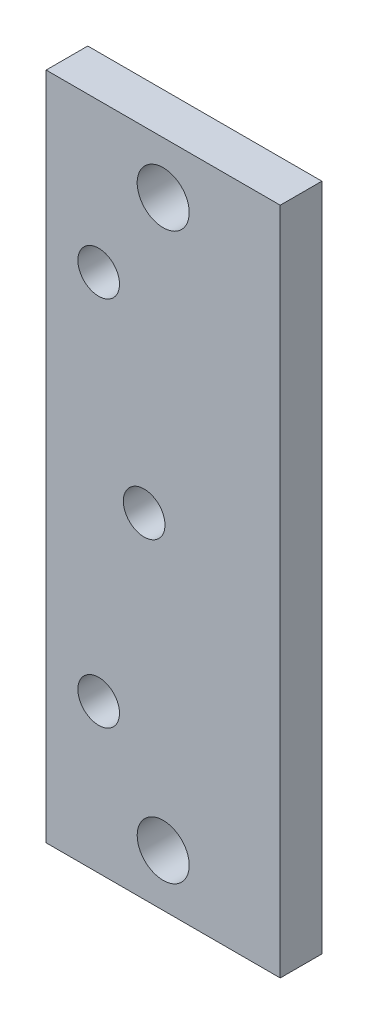
ISO-10303-21;
HEADER;
FILE_DESCRIPTION(('STEP AP214'),'2;1');
FILE_NAME('part.step','',(''),(''),'','','');
FILE_SCHEMA(('AUTOMOTIVE_DESIGN { 1 0 10303 214 1 1 1 1 }'));
ENDSEC;
DATA;
#1=APPLICATION_CONTEXT('core data for automotive mechanical design processes');
#2=APPLICATION_PROTOCOL_DEFINITION('international standard','automotive_design',2000,#1);
#3=PRODUCT_CONTEXT('',#1,'mechanical');
#4=PRODUCT('Part','Part','',(#3));
#5=PRODUCT_RELATED_PRODUCT_CATEGORY('part','',(#4));
#6=PRODUCT_DEFINITION_FORMATION('','',#4);
#7=PRODUCT_DEFINITION_CONTEXT('part definition',#1,'design');
#8=PRODUCT_DEFINITION('design','',#6,#7);
#9=PRODUCT_DEFINITION_SHAPE('','',#8);
#10=(LENGTH_UNIT() NAMED_UNIT(*) SI_UNIT(.MILLI.,.METRE.));
#11=(NAMED_UNIT(*) PLANE_ANGLE_UNIT() SI_UNIT($,.RADIAN.));
#12=(NAMED_UNIT(*) SI_UNIT($,.STERADIAN.) SOLID_ANGLE_UNIT());
#13=UNCERTAINTY_MEASURE_WITH_UNIT(LENGTH_MEASURE(1.E-05),#10,'distance_accuracy_value','');
#14=(GEOMETRIC_REPRESENTATION_CONTEXT(3) GLOBAL_UNCERTAINTY_ASSIGNED_CONTEXT((#13)) GLOBAL_UNIT_ASSIGNED_CONTEXT((#10,
#11,#12)) REPRESENTATION_CONTEXT('',''));
#15=CARTESIAN_POINT('',(0.,0.,0.));
#16=DIRECTION('',(0.,0.,1.));
#17=DIRECTION('',(1.,0.,0.));
#18=AXIS2_PLACEMENT_3D('',#15,#16,#17);
#19=CARTESIAN_POINT('',(0.,0.,0.));
#20=DIRECTION('',(0.,0.,1.));
#21=DIRECTION('',(1.,0.,0.));
#22=AXIS2_PLACEMENT_3D('',#19,#20,#21);
#23=PLANE('',#22);
#24=CARTESIAN_POINT('',(10.1018,-28.6106,0.));
#25=DIRECTION('',(0.,0.,1.));
#26=DIRECTION('',(1.,0.,0.));
#27=AXIS2_PLACEMENT_3D('',#24,#25,#26);
#28=CIRCLE('',#27,4.);
#29=CARTESIAN_POINT('',(14.1018,-28.6106,0.));
#30=VERTEX_POINT('',#29);
#31=EDGE_CURVE('E258',#30,#30,#28,.F.);
#32=ORIENTED_EDGE('',*,*,#31,.F.);
#33=EDGE_LOOP('',(#32));
#34=FACE_BOUND('',#33,.T.);
#35=CARTESIAN_POINT('',(10.1018,-100.0354,0.));
#36=DIRECTION('',(0.,0.,1.));
#37=DIRECTION('',(1.,0.,0.));
#38=AXIS2_PLACEMENT_3D('',#35,#36,#37);
#39=CIRCLE('',#38,4.);
#40=CARTESIAN_POINT('',(14.1018,-100.0354,0.));
#41=VERTEX_POINT('',#40);
#42=EDGE_CURVE('E279',#41,#41,#39,.F.);
#43=ORIENTED_EDGE('',*,*,#42,.F.);
#44=EDGE_LOOP('',(#43));
#45=FACE_BOUND('',#44,.T.);
#46=CARTESIAN_POINT('',(18.84,-64.323,0.));
#47=DIRECTION('',(0.,0.,1.));
#48=DIRECTION('',(1.,0.,0.));
#49=AXIS2_PLACEMENT_3D('',#46,#47,#48);
#50=CIRCLE('',#49,4.);
#51=CARTESIAN_POINT('',(22.84,-64.323,0.));
#52=VERTEX_POINT('',#51);
#53=EDGE_CURVE('E272',#52,#52,#50,.F.);
#54=ORIENTED_EDGE('',*,*,#53,.F.);
#55=EDGE_LOOP('',(#54));
#56=FACE_BOUND('',#55,.T.);
#57=DIRECTION('',(0.,-1.,0.));
#58=VECTOR('',#57,1.);
#59=CARTESIAN_POINT('',(27.5,-74.323,0.));
#60=LINE('',#59,#58);
#61=CARTESIAN_POINT('',(27.5,-74.323,0.));
#62=VERTEX_POINT('',#61);
#63=CARTESIAN_POINT('',(27.5,-108.646,0.));
#64=VERTEX_POINT('',#63);
#65=EDGE_CURVE('E145',#62,#64,#60,.T.);
#66=ORIENTED_EDGE('',*,*,#65,.F.);
#67=DIRECTION('',(1.,0.,0.));
#68=VECTOR('',#67,1.);
#69=CARTESIAN_POINT('',(27.5,-74.323,0.));
#70=LINE('',#69,#68);
#71=CARTESIAN_POINT('',(17.5,-74.323,0.));
#72=VERTEX_POINT('',#71);
#73=EDGE_CURVE('E158',#72,#62,#70,.T.);
#74=ORIENTED_EDGE('',*,*,#73,.F.);
#75=DIRECTION('',(0.,1.,0.));
#76=VECTOR('',#75,1.);
#77=CARTESIAN_POINT('',(17.5,-108.646,0.));
#78=LINE('',#77,#76);
#79=CARTESIAN_POINT('',(17.5,-108.646,0.));
#80=VERTEX_POINT('',#79);
#81=EDGE_CURVE('E167',#80,#72,#78,.T.);
#82=ORIENTED_EDGE('',*,*,#81,.F.);
#83=DIRECTION('',(-1.,0.,0.));
#84=VECTOR('',#83,1.);
#85=CARTESIAN_POINT('',(27.5,-108.646,0.));
#86=LINE('',#85,#84);
#87=EDGE_CURVE('E148',#64,#80,#86,.T.);
#88=ORIENTED_EDGE('',*,*,#87,.F.);
#89=EDGE_LOOP('',(#66,#74,#82,#88));
#90=FACE_BOUND('',#89,.T.);
#91=DIRECTION('',(0.,1.,0.));
#92=VECTOR('',#91,1.);
#93=CARTESIAN_POINT('',(45.,-128.646,0.));
#94=LINE('',#93,#92);
#95=CARTESIAN_POINT('',(45.,-128.646,0.));
#96=VERTEX_POINT('',#95);
#97=CARTESIAN_POINT('',(45.,0.,0.));
#98=VERTEX_POINT('',#97);
#99=EDGE_CURVE('E193',#96,#98,#94,.T.);
#100=ORIENTED_EDGE('',*,*,#99,.F.);
#101=DIRECTION('',(1.,0.,0.));
#102=VECTOR('',#101,1.);
#103=CARTESIAN_POINT('',(0.,-128.646,0.));
#104=LINE('',#103,#102);
#105=CARTESIAN_POINT('',(0.,-128.646,0.));
#106=VERTEX_POINT('',#105);
#107=EDGE_CURVE('E200',#106,#96,#104,.T.);
#108=ORIENTED_EDGE('',*,*,#107,.F.);
#109=DIRECTION('',(0.,-1.,0.));
#110=VECTOR('',#109,1.);
#111=CARTESIAN_POINT('',(0.,-128.646,0.));
#112=LINE('',#111,#110);
#113=CARTESIAN_POINT('',(0.,0.,0.));
#114=VERTEX_POINT('',#113);
#115=EDGE_CURVE('E212',#114,#106,#112,.T.);
#116=ORIENTED_EDGE('',*,*,#115,.F.);
#117=DIRECTION('',(-1.,0.,0.));
#118=VECTOR('',#117,1.);
#119=CARTESIAN_POINT('',(0.,0.,0.));
#120=LINE('',#119,#118);
#121=EDGE_CURVE('E209',#98,#114,#120,.T.);
#122=ORIENTED_EDGE('',*,*,#121,.F.);
#123=EDGE_LOOP('',(#100,#108,#116,#122));
#124=FACE_BOUND('',#123,.T.);
#125=CARTESIAN_POINT('',(22.5,-9.99999999999999,0.));
#126=DIRECTION('',(0.,0.,1.));
#127=DIRECTION('',(1.,0.,0.));
#128=AXIS2_PLACEMENT_3D('',#125,#126,#127);
#129=CIRCLE('',#128,5.);
#130=CARTESIAN_POINT('',(27.5,-9.99999999999999,0.));
#131=VERTEX_POINT('',#130);
#132=EDGE_CURVE('E187',#131,#131,#129,.T.);
#133=ORIENTED_EDGE('',*,*,#132,.T.);
#134=EDGE_LOOP('',(#133));
#135=FACE_BOUND('',#134,.T.);
#136=CARTESIAN_POINT('',(22.5,-118.646,0.));
#137=DIRECTION('',(0.,0.,1.));
#138=DIRECTION('',(-1.,0.,0.));
#139=AXIS2_PLACEMENT_3D('',#136,#137,#138);
#140=CIRCLE('',#139,5.);
#141=CARTESIAN_POINT('',(17.5,-118.646,0.));
#142=VERTEX_POINT('',#141);
#143=EDGE_CURVE('E183',#142,#142,#140,.T.);
#144=ORIENTED_EDGE('',*,*,#143,.T.);
#145=EDGE_LOOP('',(#144));
#146=FACE_BOUND('',#145,.T.);
#147=DIRECTION('',(0.,-1.,0.));
#148=VECTOR('',#147,1.);
#149=CARTESIAN_POINT('',(27.5,-20.,0.));
#150=LINE('',#149,#148);
#151=CARTESIAN_POINT('',(27.5,-20.,0.));
#152=VERTEX_POINT('',#151);
#153=CARTESIAN_POINT('',(27.5,-54.323,0.));
#154=VERTEX_POINT('',#153);
#155=EDGE_CURVE('E144',#152,#154,#150,.T.);
#156=ORIENTED_EDGE('',*,*,#155,.F.);
#157=DIRECTION('',(1.,0.,0.));
#158=VECTOR('',#157,1.);
#159=CARTESIAN_POINT('',(17.5,-20.,0.));
#160=LINE('',#159,#158);
#161=CARTESIAN_POINT('',(17.5,-20.,0.));
#162=VERTEX_POINT('',#161);
#163=EDGE_CURVE('E141',#162,#152,#160,.T.);
#164=ORIENTED_EDGE('',*,*,#163,.F.);
#165=DIRECTION('',(0.,1.,0.));
#166=VECTOR('',#165,1.);
#167=CARTESIAN_POINT('',(17.5,-54.323,0.));
#168=LINE('',#167,#166);
#169=CARTESIAN_POINT('',(17.5,-54.323,0.));
#170=VERTEX_POINT('',#169);
#171=EDGE_CURVE('E55',#170,#162,#168,.T.);
#172=ORIENTED_EDGE('',*,*,#171,.F.);
#173=DIRECTION('',(-1.,0.,0.));
#174=VECTOR('',#173,1.);
#175=CARTESIAN_POINT('',(27.5,-54.323,0.));
#176=LINE('',#175,#174);
#177=EDGE_CURVE('E50',#154,#170,#176,.T.);
#178=ORIENTED_EDGE('',*,*,#177,.F.);
#179=EDGE_LOOP('',(#156,#164,#172,#178));
#180=FACE_BOUND('',#179,.T.);
#181=ADVANCED_FACE('F35',(#34,#45,#56,#90,#124,#135,#146,#180),#23,.F.);
#182=CARTESIAN_POINT('',(0.,0.,8.));
#183=DIRECTION('',(0.,0.,1.));
#184=DIRECTION('',(1.,0.,0.));
#185=AXIS2_PLACEMENT_3D('',#182,#183,#184);
#186=PLANE('',#185);
#187=CARTESIAN_POINT('',(10.1018,-28.6106,8.));
#188=DIRECTION('',(0.,0.,1.));
#189=DIRECTION('',(1.,0.,0.));
#190=AXIS2_PLACEMENT_3D('',#187,#188,#189);
#191=CIRCLE('',#190,4.);
#192=CARTESIAN_POINT('',(14.1018,-28.6106,8.));
#193=VERTEX_POINT('',#192);
#194=EDGE_CURVE('E282',#193,#193,#191,.T.);
#195=ORIENTED_EDGE('',*,*,#194,.F.);
#196=EDGE_LOOP('',(#195));
#197=FACE_BOUND('',#196,.T.);
#198=CARTESIAN_POINT('',(10.1018,-100.0354,8.));
#199=DIRECTION('',(0.,0.,1.));
#200=DIRECTION('',(-1.,0.,0.));
#201=AXIS2_PLACEMENT_3D('',#198,#199,#200);
#202=CIRCLE('',#201,4.);
#203=CARTESIAN_POINT('',(14.1018,-100.0354,8.));
#204=VERTEX_POINT('',#203);
#205=EDGE_CURVE('E275',#204,#204,#202,.T.);
#206=ORIENTED_EDGE('',*,*,#205,.F.);
#207=EDGE_LOOP('',(#206));
#208=FACE_BOUND('',#207,.T.);
#209=CARTESIAN_POINT('',(18.84,-64.323,8.));
#210=DIRECTION('',(0.,0.,1.));
#211=DIRECTION('',(1.,0.,0.));
#212=AXIS2_PLACEMENT_3D('',#209,#210,#211);
#213=CIRCLE('',#212,4.);
#214=CARTESIAN_POINT('',(22.84,-64.323,8.));
#215=VERTEX_POINT('',#214);
#216=EDGE_CURVE('E276',#215,#215,#213,.T.);
#217=ORIENTED_EDGE('',*,*,#216,.F.);
#218=EDGE_LOOP('',(#217));
#219=FACE_BOUND('',#218,.T.);
#220=CARTESIAN_POINT('',(22.5,-9.99999999999999,8.));
#221=DIRECTION('',(0.,0.,1.));
#222=DIRECTION('',(1.,0.,0.));
#223=AXIS2_PLACEMENT_3D('',#220,#221,#222);
#224=CIRCLE('',#223,5.);
#225=CARTESIAN_POINT('',(27.5,-9.99999999999999,8.));
#226=VERTEX_POINT('',#225);
#227=EDGE_CURVE('E190',#226,#226,#224,.T.);
#228=ORIENTED_EDGE('',*,*,#227,.F.);
#229=EDGE_LOOP('',(#228));
#230=FACE_BOUND('',#229,.T.);
#231=DIRECTION('',(1.,0.,0.));
#232=VECTOR('',#231,1.);
#233=CARTESIAN_POINT('',(5.55000000000001,-128.646,8.));
#234=LINE('',#233,#232);
#235=CARTESIAN_POINT('',(0.,-128.646,8.));
#236=VERTEX_POINT('',#235);
#237=CARTESIAN_POINT('',(45.,-128.646,8.));
#238=VERTEX_POINT('',#237);
#239=EDGE_CURVE('E196',#236,#238,#234,.T.);
#240=ORIENTED_EDGE('',*,*,#239,.T.);
#241=DIRECTION('',(0.,1.,0.));
#242=VECTOR('',#241,1.);
#243=CARTESIAN_POINT('',(45.,-128.646,8.));
#244=LINE('',#243,#242);
#245=CARTESIAN_POINT('',(45.,0.,8.));
#246=VERTEX_POINT('',#245);
#247=EDGE_CURVE('E199',#238,#246,#244,.T.);
#248=ORIENTED_EDGE('',*,*,#247,.T.);
#249=DIRECTION('',(-1.,0.,0.));
#250=VECTOR('',#249,1.);
#251=CARTESIAN_POINT('',(5.,0.,8.));
#252=LINE('',#251,#250);
#253=CARTESIAN_POINT('',(0.,0.,8.));
#254=VERTEX_POINT('',#253);
#255=EDGE_CURVE('E202',#246,#254,#252,.T.);
#256=ORIENTED_EDGE('',*,*,#255,.T.);
#257=DIRECTION('',(0.,-1.,0.));
#258=VECTOR('',#257,1.);
#259=CARTESIAN_POINT('',(0.,-64.323,8.));
#260=LINE('',#259,#258);
#261=EDGE_CURVE('E204',#254,#236,#260,.T.);
#262=ORIENTED_EDGE('',*,*,#261,.T.);
#263=EDGE_LOOP('',(#240,#248,#256,#262));
#264=FACE_BOUND('',#263,.T.);
#265=CARTESIAN_POINT('',(22.5,-118.646,8.));
#266=DIRECTION('',(0.,0.,1.));
#267=DIRECTION('',(-1.,0.,0.));
#268=AXIS2_PLACEMENT_3D('',#265,#266,#267);
#269=CIRCLE('',#268,5.);
#270=CARTESIAN_POINT('',(17.5,-118.646,8.));
#271=VERTEX_POINT('',#270);
#272=EDGE_CURVE('E184',#271,#271,#269,.T.);
#273=ORIENTED_EDGE('',*,*,#272,.F.);
#274=EDGE_LOOP('',(#273));
#275=FACE_BOUND('',#274,.T.);
#276=ADVANCED_FACE('F239',(#197,#208,#219,#230,#264,#275),#186,.T.);
#277=CARTESIAN_POINT('',(45.,-128.646,8.));
#278=DIRECTION('',(-1.,0.,0.));
#279=DIRECTION('',(0.,-1.,0.));
#280=AXIS2_PLACEMENT_3D('',#277,#278,#279);
#281=PLANE('',#280);
#282=ORIENTED_EDGE('',*,*,#99,.T.);
#283=DIRECTION('',(0.,0.,-1.));
#284=VECTOR('',#283,1.);
#285=CARTESIAN_POINT('',(45.,0.,8.));
#286=LINE('',#285,#284);
#287=EDGE_CURVE('E43',#246,#98,#286,.T.);
#288=ORIENTED_EDGE('',*,*,#287,.F.);
#289=ORIENTED_EDGE('',*,*,#247,.F.);
#290=DIRECTION('',(0.,0.,-1.));
#291=VECTOR('',#290,1.);
#292=CARTESIAN_POINT('',(45.,-128.646,8.));
#293=LINE('',#292,#291);
#294=EDGE_CURVE('E11',#238,#96,#293,.T.);
#295=ORIENTED_EDGE('',*,*,#294,.T.);
#296=EDGE_LOOP('',(#282,#288,#289,#295));
#297=FACE_BOUND('',#296,.T.);
#298=ADVANCED_FACE('F37',(#297),#281,.F.);
#299=CARTESIAN_POINT('',(0.,0.,8.));
#300=DIRECTION('',(0.,-1.,0.));
#301=DIRECTION('',(1.,0.,0.));
#302=AXIS2_PLACEMENT_3D('',#299,#300,#301);
#303=PLANE('',#302);
#304=ORIENTED_EDGE('',*,*,#121,.T.);
#305=DIRECTION('',(0.,0.,-1.));
#306=VECTOR('',#305,1.);
#307=CARTESIAN_POINT('',(0.,0.,8.));
#308=LINE('',#307,#306);
#309=EDGE_CURVE('E217',#254,#114,#308,.T.);
#310=ORIENTED_EDGE('',*,*,#309,.F.);
#311=ORIENTED_EDGE('',*,*,#255,.F.);
#312=ORIENTED_EDGE('',*,*,#287,.T.);
#313=EDGE_LOOP('',(#304,#310,#311,#312));
#314=FACE_BOUND('',#313,.T.);
#315=ADVANCED_FACE('F223',(#314),#303,.F.);
#316=CARTESIAN_POINT('',(0.,-128.646,8.));
#317=DIRECTION('',(1.,0.,0.));
#318=DIRECTION('',(0.,1.,0.));
#319=AXIS2_PLACEMENT_3D('',#316,#317,#318);
#320=PLANE('',#319);
#321=ORIENTED_EDGE('',*,*,#115,.T.);
#322=DIRECTION('',(0.,0.,-1.));
#323=VECTOR('',#322,1.);
#324=CARTESIAN_POINT('',(0.,-128.646,8.));
#325=LINE('',#324,#323);
#326=EDGE_CURVE('E206',#236,#106,#325,.T.);
#327=ORIENTED_EDGE('',*,*,#326,.F.);
#328=ORIENTED_EDGE('',*,*,#261,.F.);
#329=ORIENTED_EDGE('',*,*,#309,.T.);
#330=EDGE_LOOP('',(#321,#327,#328,#329));
#331=FACE_BOUND('',#330,.T.);
#332=ADVANCED_FACE('F233',(#331),#320,.F.);
#333=CARTESIAN_POINT('',(0.,-128.646,8.));
#334=DIRECTION('',(0.,1.,0.));
#335=DIRECTION('',(0.,0.,1.));
#336=AXIS2_PLACEMENT_3D('',#333,#334,#335);
#337=PLANE('',#336);
#338=ORIENTED_EDGE('',*,*,#107,.T.);
#339=ORIENTED_EDGE('',*,*,#294,.F.);
#340=ORIENTED_EDGE('',*,*,#239,.F.);
#341=ORIENTED_EDGE('',*,*,#326,.T.);
#342=EDGE_LOOP('',(#338,#339,#340,#341));
#343=FACE_BOUND('',#342,.T.);
#344=ADVANCED_FACE('F237',(#343),#337,.F.);
#345=CARTESIAN_POINT('',(22.5,-9.99999999999999,8.));
#346=DIRECTION('',(0.,0.,-1.));
#347=DIRECTION('',(-1.,0.,0.));
#348=AXIS2_PLACEMENT_3D('',#345,#346,#347);
#349=CYLINDRICAL_SURFACE('',#348,5.);
#350=ORIENTED_EDGE('',*,*,#227,.T.);
#351=EDGE_LOOP('',(#350));
#352=FACE_BOUND('',#351,.T.);
#353=ORIENTED_EDGE('',*,*,#132,.F.);
#354=EDGE_LOOP('',(#353));
#355=FACE_BOUND('',#354,.T.);
#356=ADVANCED_FACE('F250',(#352,#355),#349,.F.);
#357=CARTESIAN_POINT('',(22.5,-118.646,8.));
#358=DIRECTION('',(0.,0.,-1.));
#359=DIRECTION('',(-1.,0.,0.));
#360=AXIS2_PLACEMENT_3D('',#357,#358,#359);
#361=CYLINDRICAL_SURFACE('',#360,5.);
#362=ORIENTED_EDGE('',*,*,#272,.T.);
#363=EDGE_LOOP('',(#362));
#364=FACE_BOUND('',#363,.T.);
#365=ORIENTED_EDGE('',*,*,#143,.F.);
#366=EDGE_LOOP('',(#365));
#367=FACE_BOUND('',#366,.T.);
#368=ADVANCED_FACE('F246',(#364,#367),#361,.F.);
#369=CARTESIAN_POINT('',(27.5,-74.323,-6.));
#370=DIRECTION('',(-1.,0.,0.));
#371=DIRECTION('',(0.,-1.,0.));
#372=AXIS2_PLACEMENT_3D('',#369,#370,#371);
#373=PLANE('',#372);
#374=ORIENTED_EDGE('',*,*,#65,.T.);
#375=DIRECTION('',(0.,0.,1.));
#376=VECTOR('',#375,1.);
#377=CARTESIAN_POINT('',(27.5,-108.646,-6.));
#378=LINE('',#377,#376);
#379=CARTESIAN_POINT('',(27.5,-108.646,-6.));
#380=VERTEX_POINT('',#379);
#381=EDGE_CURVE('E180',#380,#64,#378,.T.);
#382=ORIENTED_EDGE('',*,*,#381,.F.);
#383=DIRECTION('',(0.,-1.,0.));
#384=VECTOR('',#383,1.);
#385=CARTESIAN_POINT('',(27.5,-74.323,-6.));
#386=LINE('',#385,#384);
#387=CARTESIAN_POINT('',(27.5,-74.323,-6.));
#388=VERTEX_POINT('',#387);
#389=EDGE_CURVE('E154',#388,#380,#386,.T.);
#390=ORIENTED_EDGE('',*,*,#389,.F.);
#391=DIRECTION('',(0.,0.,1.));
#392=VECTOR('',#391,1.);
#393=CARTESIAN_POINT('',(27.5,-74.323,-6.));
#394=LINE('',#393,#392);
#395=EDGE_CURVE('E163',#388,#62,#394,.T.);
#396=ORIENTED_EDGE('',*,*,#395,.T.);
#397=EDGE_LOOP('',(#374,#382,#390,#396));
#398=FACE_BOUND('',#397,.T.);
#399=ADVANCED_FACE('F249',(#398),#373,.F.);
#400=CARTESIAN_POINT('',(27.5,-108.646,-6.));
#401=DIRECTION('',(0.,1.,0.));
#402=DIRECTION('',(0.,0.,1.));
#403=AXIS2_PLACEMENT_3D('',#400,#401,#402);
#404=PLANE('',#403);
#405=ORIENTED_EDGE('',*,*,#87,.T.);
#406=DIRECTION('',(0.,0.,1.));
#407=VECTOR('',#406,1.);
#408=CARTESIAN_POINT('',(17.5,-108.646,-6.));
#409=LINE('',#408,#407);
#410=CARTESIAN_POINT('',(17.5,-108.646,-6.));
#411=VERTEX_POINT('',#410);
#412=EDGE_CURVE('E177',#411,#80,#409,.T.);
#413=ORIENTED_EDGE('',*,*,#412,.F.);
#414=DIRECTION('',(-1.,0.,0.));
#415=VECTOR('',#414,1.);
#416=CARTESIAN_POINT('',(27.5,-108.646,-6.));
#417=LINE('',#416,#415);
#418=EDGE_CURVE('E157',#380,#411,#417,.T.);
#419=ORIENTED_EDGE('',*,*,#418,.F.);
#420=ORIENTED_EDGE('',*,*,#381,.T.);
#421=EDGE_LOOP('',(#405,#413,#419,#420));
#422=FACE_BOUND('',#421,.T.);
#423=ADVANCED_FACE('F402',(#422),#404,.F.);
#424=CARTESIAN_POINT('',(17.5,-108.646,-6.));
#425=DIRECTION('',(1.,0.,0.));
#426=DIRECTION('',(0.,1.,0.));
#427=AXIS2_PLACEMENT_3D('',#424,#425,#426);
#428=PLANE('',#427);
#429=ORIENTED_EDGE('',*,*,#81,.T.);
#430=DIRECTION('',(0.,0.,1.));
#431=VECTOR('',#430,1.);
#432=CARTESIAN_POINT('',(17.5,-74.323,-6.));
#433=LINE('',#432,#431);
#434=CARTESIAN_POINT('',(17.5,-74.323,-6.));
#435=VERTEX_POINT('',#434);
#436=EDGE_CURVE('E174',#435,#72,#433,.T.);
#437=ORIENTED_EDGE('',*,*,#436,.F.);
#438=DIRECTION('',(0.,1.,0.));
#439=VECTOR('',#438,1.);
#440=CARTESIAN_POINT('',(17.5,-108.646,-6.));
#441=LINE('',#440,#439);
#442=EDGE_CURVE('E160',#411,#435,#441,.T.);
#443=ORIENTED_EDGE('',*,*,#442,.F.);
#444=ORIENTED_EDGE('',*,*,#412,.T.);
#445=EDGE_LOOP('',(#429,#437,#443,#444));
#446=FACE_BOUND('',#445,.T.);
#447=ADVANCED_FACE('F392',(#446),#428,.F.);
#448=CARTESIAN_POINT('',(27.5,-74.323,-6.));
#449=DIRECTION('',(0.,-1.,0.));
#450=DIRECTION('',(0.,0.,-1.));
#451=AXIS2_PLACEMENT_3D('',#448,#449,#450);
#452=PLANE('',#451);
#453=ORIENTED_EDGE('',*,*,#73,.T.);
#454=ORIENTED_EDGE('',*,*,#395,.F.);
#455=DIRECTION('',(1.,0.,0.));
#456=VECTOR('',#455,1.);
#457=CARTESIAN_POINT('',(27.5,-74.323,-6.));
#458=LINE('',#457,#456);
#459=EDGE_CURVE('E162',#435,#388,#458,.T.);
#460=ORIENTED_EDGE('',*,*,#459,.F.);
#461=ORIENTED_EDGE('',*,*,#436,.T.);
#462=EDGE_LOOP('',(#453,#454,#460,#461));
#463=FACE_BOUND('',#462,.T.);
#464=ADVANCED_FACE('F382',(#463),#452,.F.);
#465=CARTESIAN_POINT('',(0.,0.,-6.));
#466=DIRECTION('',(0.,0.,-1.));
#467=DIRECTION('',(-1.,0.,0.));
#468=AXIS2_PLACEMENT_3D('',#465,#466,#467);
#469=PLANE('',#468);
#470=ORIENTED_EDGE('',*,*,#389,.T.);
#471=ORIENTED_EDGE('',*,*,#418,.T.);
#472=ORIENTED_EDGE('',*,*,#442,.T.);
#473=ORIENTED_EDGE('',*,*,#459,.T.);
#474=EDGE_LOOP('',(#470,#471,#472,#473));
#475=FACE_BOUND('',#474,.T.);
#476=ADVANCED_FACE('F373',(#475),#469,.T.);
#477=CARTESIAN_POINT('',(27.5,-20.,-6.));
#478=DIRECTION('',(-1.,0.,0.));
#479=DIRECTION('',(0.,-1.,0.));
#480=AXIS2_PLACEMENT_3D('',#477,#478,#479);
#481=PLANE('',#480);
#482=ORIENTED_EDGE('',*,*,#155,.T.);
#483=DIRECTION('',(0.,0.,1.));
#484=VECTOR('',#483,1.);
#485=CARTESIAN_POINT('',(27.5,-54.323,-6.));
#486=LINE('',#485,#484);
#487=CARTESIAN_POINT('',(27.5,-54.323,-6.));
#488=VERTEX_POINT('',#487);
#489=EDGE_CURVE('E125',#488,#154,#486,.T.);
#490=ORIENTED_EDGE('',*,*,#489,.F.);
#491=DIRECTION('',(0.,-1.,0.));
#492=VECTOR('',#491,1.);
#493=CARTESIAN_POINT('',(27.5,-20.,-6.));
#494=LINE('',#493,#492);
#495=CARTESIAN_POINT('',(27.5,-20.,-6.));
#496=VERTEX_POINT('',#495);
#497=EDGE_CURVE('E132',#496,#488,#494,.T.);
#498=ORIENTED_EDGE('',*,*,#497,.F.);
#499=DIRECTION('',(0.,0.,1.));
#500=VECTOR('',#499,1.);
#501=CARTESIAN_POINT('',(27.5,-20.,-6.));
#502=LINE('',#501,#500);
#503=EDGE_CURVE('E263',#496,#152,#502,.T.);
#504=ORIENTED_EDGE('',*,*,#503,.T.);
#505=EDGE_LOOP('',(#482,#490,#498,#504));
#506=FACE_BOUND('',#505,.T.);
#507=ADVANCED_FACE('F143',(#506),#481,.F.);
#508=CARTESIAN_POINT('',(27.5,-54.323,-6.));
#509=DIRECTION('',(0.,1.,0.));
#510=DIRECTION('',(0.,0.,1.));
#511=AXIS2_PLACEMENT_3D('',#508,#509,#510);
#512=PLANE('',#511);
#513=ORIENTED_EDGE('',*,*,#177,.T.);
#514=DIRECTION('',(0.,0.,1.));
#515=VECTOR('',#514,1.);
#516=CARTESIAN_POINT('',(17.5,-54.323,-6.));
#517=LINE('',#516,#515);
#518=CARTESIAN_POINT('',(17.5,-54.323,-6.));
#519=VERTEX_POINT('',#518);
#520=EDGE_CURVE('E128',#519,#170,#517,.T.);
#521=ORIENTED_EDGE('',*,*,#520,.F.);
#522=DIRECTION('',(-1.,0.,0.));
#523=VECTOR('',#522,1.);
#524=CARTESIAN_POINT('',(27.5,-54.323,-6.));
#525=LINE('',#524,#523);
#526=EDGE_CURVE('E121',#488,#519,#525,.T.);
#527=ORIENTED_EDGE('',*,*,#526,.F.);
#528=ORIENTED_EDGE('',*,*,#489,.T.);
#529=EDGE_LOOP('',(#513,#521,#527,#528));
#530=FACE_BOUND('',#529,.T.);
#531=ADVANCED_FACE('F123',(#530),#512,.F.);
#532=CARTESIAN_POINT('',(17.5,-54.323,-6.));
#533=DIRECTION('',(1.,0.,0.));
#534=DIRECTION('',(0.,1.,0.));
#535=AXIS2_PLACEMENT_3D('',#532,#533,#534);
#536=PLANE('',#535);
#537=ORIENTED_EDGE('',*,*,#171,.T.);
#538=DIRECTION('',(0.,0.,1.));
#539=VECTOR('',#538,1.);
#540=CARTESIAN_POINT('',(17.5,-20.,-6.));
#541=LINE('',#540,#539);
#542=CARTESIAN_POINT('',(17.5,-20.,-6.));
#543=VERTEX_POINT('',#542);
#544=EDGE_CURVE('E150',#543,#162,#541,.T.);
#545=ORIENTED_EDGE('',*,*,#544,.F.);
#546=DIRECTION('',(0.,1.,0.));
#547=VECTOR('',#546,1.);
#548=CARTESIAN_POINT('',(17.5,-54.323,-6.));
#549=LINE('',#548,#547);
#550=EDGE_CURVE('E131',#519,#543,#549,.T.);
#551=ORIENTED_EDGE('',*,*,#550,.F.);
#552=ORIENTED_EDGE('',*,*,#520,.T.);
#553=EDGE_LOOP('',(#537,#545,#551,#552));
#554=FACE_BOUND('',#553,.T.);
#555=ADVANCED_FACE('F347',(#554),#536,.F.);
#556=CARTESIAN_POINT('',(17.5,-20.,-6.));
#557=DIRECTION('',(0.,-1.,0.));
#558=DIRECTION('',(0.,0.,-1.));
#559=AXIS2_PLACEMENT_3D('',#556,#557,#558);
#560=PLANE('',#559);
#561=ORIENTED_EDGE('',*,*,#163,.T.);
#562=ORIENTED_EDGE('',*,*,#503,.F.);
#563=DIRECTION('',(1.,0.,0.));
#564=VECTOR('',#563,1.);
#565=CARTESIAN_POINT('',(17.5,-20.,-6.));
#566=LINE('',#565,#564);
#567=EDGE_CURVE('E137',#543,#496,#566,.T.);
#568=ORIENTED_EDGE('',*,*,#567,.F.);
#569=ORIENTED_EDGE('',*,*,#544,.T.);
#570=EDGE_LOOP('',(#561,#562,#568,#569));
#571=FACE_BOUND('',#570,.T.);
#572=ADVANCED_FACE('F262',(#571),#560,.F.);
#573=CARTESIAN_POINT('',(0.,0.,-6.));
#574=DIRECTION('',(0.,0.,-1.));
#575=DIRECTION('',(-1.,0.,0.));
#576=AXIS2_PLACEMENT_3D('',#573,#574,#575);
#577=PLANE('',#576);
#578=ORIENTED_EDGE('',*,*,#497,.T.);
#579=ORIENTED_EDGE('',*,*,#526,.T.);
#580=ORIENTED_EDGE('',*,*,#550,.T.);
#581=ORIENTED_EDGE('',*,*,#567,.T.);
#582=EDGE_LOOP('',(#578,#579,#580,#581));
#583=FACE_BOUND('',#582,.T.);
#584=ADVANCED_FACE('F135',(#583),#577,.T.);
#585=CARTESIAN_POINT('',(18.84,-64.323,-6.001));
#586=DIRECTION('',(0.,0.,1.));
#587=DIRECTION('',(1.,0.,0.));
#588=AXIS2_PLACEMENT_3D('',#585,#586,#587);
#589=CYLINDRICAL_SURFACE('',#588,4.);
#590=CARTESIAN_POINT('',(22.84,-64.323,8.));
#591=CARTESIAN_POINT('',(22.84,-64.323,7.91666666666667));
#592=CARTESIAN_POINT('',(22.84,-64.323,7.83333333333333));
#593=CARTESIAN_POINT('',(22.84,-64.323,7.66666666666666));
#594=CARTESIAN_POINT('',(22.84,-64.323,7.58333333333333));
#595=CARTESIAN_POINT('',(22.84,-64.323,7.41666666666666));
#596=CARTESIAN_POINT('',(22.84,-64.323,7.33333333333333));
#597=CARTESIAN_POINT('',(22.84,-64.323,7.16666666666666));
#598=CARTESIAN_POINT('',(22.84,-64.323,7.08333333333333));
#599=CARTESIAN_POINT('',(22.84,-64.323,6.91666666666666));
#600=CARTESIAN_POINT('',(22.84,-64.323,6.83333333333333));
#601=CARTESIAN_POINT('',(22.84,-64.323,6.66666666666667));
#602=CARTESIAN_POINT('',(22.84,-64.323,6.58333333333333));
#603=CARTESIAN_POINT('',(22.84,-64.323,6.41666666666667));
#604=CARTESIAN_POINT('',(22.84,-64.323,6.33333333333333));
#605=CARTESIAN_POINT('',(22.84,-64.323,6.16666666666667));
#606=CARTESIAN_POINT('',(22.84,-64.323,6.08333333333333));
#607=CARTESIAN_POINT('',(22.84,-64.323,5.91666666666666));
#608=CARTESIAN_POINT('',(22.84,-64.323,5.83333333333333));
#609=CARTESIAN_POINT('',(22.84,-64.323,5.66666666666666));
#610=CARTESIAN_POINT('',(22.84,-64.323,5.58333333333333));
#611=CARTESIAN_POINT('',(22.84,-64.323,5.41666666666667));
#612=CARTESIAN_POINT('',(22.84,-64.323,5.33333333333333));
#613=CARTESIAN_POINT('',(22.84,-64.323,5.16666666666667));
#614=CARTESIAN_POINT('',(22.84,-64.323,5.08333333333333));
#615=CARTESIAN_POINT('',(22.84,-64.323,4.91666666666667));
#616=CARTESIAN_POINT('',(22.84,-64.323,4.83333333333333));
#617=CARTESIAN_POINT('',(22.84,-64.323,4.66666666666667));
#618=CARTESIAN_POINT('',(22.84,-64.323,4.58333333333333));
#619=CARTESIAN_POINT('',(22.84,-64.323,4.41666666666667));
#620=CARTESIAN_POINT('',(22.84,-64.323,4.33333333333333));
#621=CARTESIAN_POINT('',(22.84,-64.323,4.16666666666667));
#622=CARTESIAN_POINT('',(22.84,-64.323,4.08333333333333));
#623=CARTESIAN_POINT('',(22.84,-64.323,3.91666666666666));
#624=CARTESIAN_POINT('',(22.84,-64.323,3.83333333333333));
#625=CARTESIAN_POINT('',(22.84,-64.323,3.66666666666666));
#626=CARTESIAN_POINT('',(22.84,-64.323,3.58333333333333));
#627=CARTESIAN_POINT('',(22.84,-64.323,3.41666666666666));
#628=CARTESIAN_POINT('',(22.84,-64.323,3.33333333333333));
#629=CARTESIAN_POINT('',(22.84,-64.323,3.16666666666666));
#630=CARTESIAN_POINT('',(22.84,-64.323,3.08333333333333));
#631=CARTESIAN_POINT('',(22.84,-64.323,2.91666666666666));
#632=CARTESIAN_POINT('',(22.84,-64.323,2.83333333333333));
#633=CARTESIAN_POINT('',(22.84,-64.323,2.66666666666666));
#634=CARTESIAN_POINT('',(22.84,-64.323,2.58333333333333));
#635=CARTESIAN_POINT('',(22.84,-64.323,2.41666666666667));
#636=CARTESIAN_POINT('',(22.84,-64.323,2.33333333333333));
#637=CARTESIAN_POINT('',(22.84,-64.323,2.16666666666667));
#638=CARTESIAN_POINT('',(22.84,-64.323,2.08333333333333));
#639=CARTESIAN_POINT('',(22.84,-64.323,1.91666666666667));
#640=CARTESIAN_POINT('',(22.84,-64.323,1.83333333333333));
#641=CARTESIAN_POINT('',(22.84,-64.323,1.66666666666667));
#642=CARTESIAN_POINT('',(22.84,-64.323,1.58333333333333));
#643=CARTESIAN_POINT('',(22.84,-64.323,1.41666666666667));
#644=CARTESIAN_POINT('',(22.84,-64.323,1.33333333333333));
#645=CARTESIAN_POINT('',(22.84,-64.323,1.16666666666667));
#646=CARTESIAN_POINT('',(22.84,-64.323,1.08333333333333));
#647=CARTESIAN_POINT('',(22.84,-64.323,0.916666666666666));
#648=CARTESIAN_POINT('',(22.84,-64.323,0.833333333333332));
#649=CARTESIAN_POINT('',(22.84,-64.323,0.666666666666666));
#650=CARTESIAN_POINT('',(22.84,-64.323,0.583333333333333));
#651=CARTESIAN_POINT('',(22.84,-64.323,0.416666666666666));
#652=CARTESIAN_POINT('',(22.84,-64.323,0.333333333333333));
#653=CARTESIAN_POINT('',(22.84,-64.323,0.166666666666666));
#654=CARTESIAN_POINT('',(22.84,-64.323,0.0833333333333325));
#655=CARTESIAN_POINT('',(22.84,-64.323,0.));
#656=B_SPLINE_CURVE_WITH_KNOTS('',3,(#590,#591,#592,#593,#594,#595,#596,#597,#598,#599,#600,
#601,#602,#603,#604,#605,#606,#607,#608,#609,#610,#611,#612,#613,#614,#615,#616,#617,#618,#619,
#620,#621,#622,#623,#624,#625,#626,#627,#628,#629,#630,#631,#632,#633,#634,#635,#636,#637,#638,
#639,#640,#641,#642,#643,#644,#645,#646,#647,#648,#649,#650,#651,#652,#653,#654,#655),
.UNSPECIFIED.,.F.,.F.,(4,2,2,2,2,2,2,2,2,2,2,2,2,2,2,2,2,2,2,2,2,2,2,2,2,2,2,2,2,2,2,2,4),(0.,
0.25,0.5,0.750000000000001,1.,1.25,1.5,1.75,2.,2.25,2.5,2.75,3.,3.25,3.5,3.75,4.,4.25,4.5,4.75,
5.,5.25,5.5,5.75,6.,6.25,6.5,6.75,7.,7.25,7.5,7.75,8.),.UNSPECIFIED.);
#657=EDGE_CURVE('BSEAM336',#215,#52,#656,.T.);
#658=ORIENTED_EDGE('',*,*,#216,.T.);
#659=ORIENTED_EDGE('',*,*,#53,.T.);
#660=ORIENTED_EDGE('',*,*,#657,.T.);
#661=ORIENTED_EDGE('',*,*,#657,.F.);
#662=EDGE_LOOP('',(#658,#660,#659,#661));
#663=FACE_BOUND('',#662,.T.);
#664=ADVANCED_FACE('F336',(#663),#589,.F.);
#665=CARTESIAN_POINT('',(10.1018,-100.0354,-6.001));
#666=DIRECTION('',(0.,0.,1.));
#667=DIRECTION('',(1.,0.,0.));
#668=AXIS2_PLACEMENT_3D('',#665,#666,#667);
#669=CYLINDRICAL_SURFACE('',#668,4.);
#670=CARTESIAN_POINT('',(14.1018,-100.0354,8.));
#671=CARTESIAN_POINT('',(14.1018,-100.0354,7.91666666666667));
#672=CARTESIAN_POINT('',(14.1018,-100.0354,7.83333333333333));
#673=CARTESIAN_POINT('',(14.1018,-100.0354,7.66666666666666));
#674=CARTESIAN_POINT('',(14.1018,-100.0354,7.58333333333333));
#675=CARTESIAN_POINT('',(14.1018,-100.0354,7.41666666666666));
#676=CARTESIAN_POINT('',(14.1018,-100.0354,7.33333333333333));
#677=CARTESIAN_POINT('',(14.1018,-100.0354,7.16666666666666));
#678=CARTESIAN_POINT('',(14.1018,-100.0354,7.08333333333333));
#679=CARTESIAN_POINT('',(14.1018,-100.0354,6.91666666666666));
#680=CARTESIAN_POINT('',(14.1018,-100.0354,6.83333333333333));
#681=CARTESIAN_POINT('',(14.1018,-100.0354,6.66666666666667));
#682=CARTESIAN_POINT('',(14.1018,-100.0354,6.58333333333333));
#683=CARTESIAN_POINT('',(14.1018,-100.0354,6.41666666666667));
#684=CARTESIAN_POINT('',(14.1018,-100.0354,6.33333333333333));
#685=CARTESIAN_POINT('',(14.1018,-100.0354,6.16666666666667));
#686=CARTESIAN_POINT('',(14.1018,-100.0354,6.08333333333333));
#687=CARTESIAN_POINT('',(14.1018,-100.0354,5.91666666666666));
#688=CARTESIAN_POINT('',(14.1018,-100.0354,5.83333333333333));
#689=CARTESIAN_POINT('',(14.1018,-100.0354,5.66666666666666));
#690=CARTESIAN_POINT('',(14.1018,-100.0354,5.58333333333333));
#691=CARTESIAN_POINT('',(14.1018,-100.0354,5.41666666666667));
#692=CARTESIAN_POINT('',(14.1018,-100.0354,5.33333333333333));
#693=CARTESIAN_POINT('',(14.1018,-100.0354,5.16666666666667));
#694=CARTESIAN_POINT('',(14.1018,-100.0354,5.08333333333333));
#695=CARTESIAN_POINT('',(14.1018,-100.0354,4.91666666666667));
#696=CARTESIAN_POINT('',(14.1018,-100.0354,4.83333333333333));
#697=CARTESIAN_POINT('',(14.1018,-100.0354,4.66666666666667));
#698=CARTESIAN_POINT('',(14.1018,-100.0354,4.58333333333333));
#699=CARTESIAN_POINT('',(14.1018,-100.0354,4.41666666666667));
#700=CARTESIAN_POINT('',(14.1018,-100.0354,4.33333333333333));
#701=CARTESIAN_POINT('',(14.1018,-100.0354,4.16666666666667));
#702=CARTESIAN_POINT('',(14.1018,-100.0354,4.08333333333333));
#703=CARTESIAN_POINT('',(14.1018,-100.0354,3.91666666666666));
#704=CARTESIAN_POINT('',(14.1018,-100.0354,3.83333333333333));
#705=CARTESIAN_POINT('',(14.1018,-100.0354,3.66666666666666));
#706=CARTESIAN_POINT('',(14.1018,-100.0354,3.58333333333333));
#707=CARTESIAN_POINT('',(14.1018,-100.0354,3.41666666666666));
#708=CARTESIAN_POINT('',(14.1018,-100.0354,3.33333333333333));
#709=CARTESIAN_POINT('',(14.1018,-100.0354,3.16666666666666));
#710=CARTESIAN_POINT('',(14.1018,-100.0354,3.08333333333333));
#711=CARTESIAN_POINT('',(14.1018,-100.0354,2.91666666666666));
#712=CARTESIAN_POINT('',(14.1018,-100.0354,2.83333333333333));
#713=CARTESIAN_POINT('',(14.1018,-100.0354,2.66666666666666));
#714=CARTESIAN_POINT('',(14.1018,-100.0354,2.58333333333333));
#715=CARTESIAN_POINT('',(14.1018,-100.0354,2.41666666666667));
#716=CARTESIAN_POINT('',(14.1018,-100.0354,2.33333333333333));
#717=CARTESIAN_POINT('',(14.1018,-100.0354,2.16666666666667));
#718=CARTESIAN_POINT('',(14.1018,-100.0354,2.08333333333333));
#719=CARTESIAN_POINT('',(14.1018,-100.0354,1.91666666666667));
#720=CARTESIAN_POINT('',(14.1018,-100.0354,1.83333333333333));
#721=CARTESIAN_POINT('',(14.1018,-100.0354,1.66666666666667));
#722=CARTESIAN_POINT('',(14.1018,-100.0354,1.58333333333333));
#723=CARTESIAN_POINT('',(14.1018,-100.0354,1.41666666666667));
#724=CARTESIAN_POINT('',(14.1018,-100.0354,1.33333333333333));
#725=CARTESIAN_POINT('',(14.1018,-100.0354,1.16666666666667));
#726=CARTESIAN_POINT('',(14.1018,-100.0354,1.08333333333333));
#727=CARTESIAN_POINT('',(14.1018,-100.0354,0.916666666666666));
#728=CARTESIAN_POINT('',(14.1018,-100.0354,0.833333333333332));
#729=CARTESIAN_POINT('',(14.1018,-100.0354,0.666666666666666));
#730=CARTESIAN_POINT('',(14.1018,-100.0354,0.583333333333333));
#731=CARTESIAN_POINT('',(14.1018,-100.0354,0.416666666666666));
#732=CARTESIAN_POINT('',(14.1018,-100.0354,0.333333333333333));
#733=CARTESIAN_POINT('',(14.1018,-100.0354,0.166666666666666));
#734=CARTESIAN_POINT('',(14.1018,-100.0354,0.0833333333333325));
#735=CARTESIAN_POINT('',(14.1018,-100.0354,0.));
#736=B_SPLINE_CURVE_WITH_KNOTS('',3,(#670,#671,#672,#673,#674,#675,#676,#677,#678,#679,#680,
#681,#682,#683,#684,#685,#686,#687,#688,#689,#690,#691,#692,#693,#694,#695,#696,#697,#698,#699,
#700,#701,#702,#703,#704,#705,#706,#707,#708,#709,#710,#711,#712,#713,#714,#715,#716,#717,#718,
#719,#720,#721,#722,#723,#724,#725,#726,#727,#728,#729,#730,#731,#732,#733,#734,#735),
.UNSPECIFIED.,.F.,.F.,(4,2,2,2,2,2,2,2,2,2,2,2,2,2,2,2,2,2,2,2,2,2,2,2,2,2,2,2,2,2,2,2,4),(0.,
0.25,0.5,0.750000000000001,1.,1.25,1.5,1.75,2.,2.25,2.5,2.75,3.,3.25,3.5,3.75,4.,4.25,4.5,4.75,
5.,5.25,5.5,5.75,6.,6.25,6.5,6.75,7.,7.25,7.5,7.75,8.),.UNSPECIFIED.);
#737=EDGE_CURVE('BSEAM463',#204,#41,#736,.T.);
#738=ORIENTED_EDGE('',*,*,#205,.T.);
#739=ORIENTED_EDGE('',*,*,#42,.T.);
#740=ORIENTED_EDGE('',*,*,#737,.T.);
#741=ORIENTED_EDGE('',*,*,#737,.F.);
#742=EDGE_LOOP('',(#738,#740,#739,#741));
#743=FACE_BOUND('',#742,.T.);
#744=ADVANCED_FACE('F463',(#743),#669,.F.);
#745=CARTESIAN_POINT('',(10.1018,-28.6106,-6.001));
#746=DIRECTION('',(0.,0.,1.));
#747=DIRECTION('',(1.,0.,0.));
#748=AXIS2_PLACEMENT_3D('',#745,#746,#747);
#749=CYLINDRICAL_SURFACE('',#748,4.);
#750=CARTESIAN_POINT('',(14.1018,-28.6106,8.));
#751=CARTESIAN_POINT('',(14.1018,-28.6106,7.91666666666667));
#752=CARTESIAN_POINT('',(14.1018,-28.6106,7.83333333333333));
#753=CARTESIAN_POINT('',(14.1018,-28.6106,7.66666666666666));
#754=CARTESIAN_POINT('',(14.1018,-28.6106,7.58333333333333));
#755=CARTESIAN_POINT('',(14.1018,-28.6106,7.41666666666666));
#756=CARTESIAN_POINT('',(14.1018,-28.6106,7.33333333333333));
#757=CARTESIAN_POINT('',(14.1018,-28.6106,7.16666666666666));
#758=CARTESIAN_POINT('',(14.1018,-28.6106,7.08333333333333));
#759=CARTESIAN_POINT('',(14.1018,-28.6106,6.91666666666666));
#760=CARTESIAN_POINT('',(14.1018,-28.6106,6.83333333333333));
#761=CARTESIAN_POINT('',(14.1018,-28.6106,6.66666666666667));
#762=CARTESIAN_POINT('',(14.1018,-28.6106,6.58333333333333));
#763=CARTESIAN_POINT('',(14.1018,-28.6106,6.41666666666667));
#764=CARTESIAN_POINT('',(14.1018,-28.6106,6.33333333333333));
#765=CARTESIAN_POINT('',(14.1018,-28.6106,6.16666666666667));
#766=CARTESIAN_POINT('',(14.1018,-28.6106,6.08333333333333));
#767=CARTESIAN_POINT('',(14.1018,-28.6106,5.91666666666666));
#768=CARTESIAN_POINT('',(14.1018,-28.6106,5.83333333333333));
#769=CARTESIAN_POINT('',(14.1018,-28.6106,5.66666666666666));
#770=CARTESIAN_POINT('',(14.1018,-28.6106,5.58333333333333));
#771=CARTESIAN_POINT('',(14.1018,-28.6106,5.41666666666667));
#772=CARTESIAN_POINT('',(14.1018,-28.6106,5.33333333333333));
#773=CARTESIAN_POINT('',(14.1018,-28.6106,5.16666666666667));
#774=CARTESIAN_POINT('',(14.1018,-28.6106,5.08333333333333));
#775=CARTESIAN_POINT('',(14.1018,-28.6106,4.91666666666667));
#776=CARTESIAN_POINT('',(14.1018,-28.6106,4.83333333333333));
#777=CARTESIAN_POINT('',(14.1018,-28.6106,4.66666666666667));
#778=CARTESIAN_POINT('',(14.1018,-28.6106,4.58333333333333));
#779=CARTESIAN_POINT('',(14.1018,-28.6106,4.41666666666667));
#780=CARTESIAN_POINT('',(14.1018,-28.6106,4.33333333333333));
#781=CARTESIAN_POINT('',(14.1018,-28.6106,4.16666666666667));
#782=CARTESIAN_POINT('',(14.1018,-28.6106,4.08333333333333));
#783=CARTESIAN_POINT('',(14.1018,-28.6106,3.91666666666666));
#784=CARTESIAN_POINT('',(14.1018,-28.6106,3.83333333333333));
#785=CARTESIAN_POINT('',(14.1018,-28.6106,3.66666666666666));
#786=CARTESIAN_POINT('',(14.1018,-28.6106,3.58333333333333));
#787=CARTESIAN_POINT('',(14.1018,-28.6106,3.41666666666666));
#788=CARTESIAN_POINT('',(14.1018,-28.6106,3.33333333333333));
#789=CARTESIAN_POINT('',(14.1018,-28.6106,3.16666666666666));
#790=CARTESIAN_POINT('',(14.1018,-28.6106,3.08333333333333));
#791=CARTESIAN_POINT('',(14.1018,-28.6106,2.91666666666666));
#792=CARTESIAN_POINT('',(14.1018,-28.6106,2.83333333333333));
#793=CARTESIAN_POINT('',(14.1018,-28.6106,2.66666666666666));
#794=CARTESIAN_POINT('',(14.1018,-28.6106,2.58333333333333));
#795=CARTESIAN_POINT('',(14.1018,-28.6106,2.41666666666667));
#796=CARTESIAN_POINT('',(14.1018,-28.6106,2.33333333333333));
#797=CARTESIAN_POINT('',(14.1018,-28.6106,2.16666666666667));
#798=CARTESIAN_POINT('',(14.1018,-28.6106,2.08333333333333));
#799=CARTESIAN_POINT('',(14.1018,-28.6106,1.91666666666667));
#800=CARTESIAN_POINT('',(14.1018,-28.6106,1.83333333333333));
#801=CARTESIAN_POINT('',(14.1018,-28.6106,1.66666666666667));
#802=CARTESIAN_POINT('',(14.1018,-28.6106,1.58333333333333));
#803=CARTESIAN_POINT('',(14.1018,-28.6106,1.41666666666667));
#804=CARTESIAN_POINT('',(14.1018,-28.6106,1.33333333333333));
#805=CARTESIAN_POINT('',(14.1018,-28.6106,1.16666666666667));
#806=CARTESIAN_POINT('',(14.1018,-28.6106,1.08333333333333));
#807=CARTESIAN_POINT('',(14.1018,-28.6106,0.916666666666666));
#808=CARTESIAN_POINT('',(14.1018,-28.6106,0.833333333333332));
#809=CARTESIAN_POINT('',(14.1018,-28.6106,0.666666666666666));
#810=CARTESIAN_POINT('',(14.1018,-28.6106,0.583333333333333));
#811=CARTESIAN_POINT('',(14.1018,-28.6106,0.416666666666666));
#812=CARTESIAN_POINT('',(14.1018,-28.6106,0.333333333333333));
#813=CARTESIAN_POINT('',(14.1018,-28.6106,0.166666666666666));
#814=CARTESIAN_POINT('',(14.1018,-28.6106,0.0833333333333325));
#815=CARTESIAN_POINT('',(14.1018,-28.6106,0.));
#816=B_SPLINE_CURVE_WITH_KNOTS('',3,(#750,#751,#752,#753,#754,#755,#756,#757,#758,#759,#760,
#761,#762,#763,#764,#765,#766,#767,#768,#769,#770,#771,#772,#773,#774,#775,#776,#777,#778,#779,
#780,#781,#782,#783,#784,#785,#786,#787,#788,#789,#790,#791,#792,#793,#794,#795,#796,#797,#798,
#799,#800,#801,#802,#803,#804,#805,#806,#807,#808,#809,#810,#811,#812,#813,#814,#815),
.UNSPECIFIED.,.F.,.F.,(4,2,2,2,2,2,2,2,2,2,2,2,2,2,2,2,2,2,2,2,2,2,2,2,2,2,2,2,2,2,2,2,4),(0.,
0.25,0.5,0.750000000000001,1.,1.25,1.5,1.75,2.,2.25,2.5,2.75,3.,3.25,3.5,3.75,4.,4.25,4.5,4.75,
5.,5.25,5.5,5.75,6.,6.25,6.5,6.75,7.,7.25,7.5,7.75,8.),.UNSPECIFIED.);
#817=EDGE_CURVE('BSEAM290',#193,#30,#816,.T.);
#818=ORIENTED_EDGE('',*,*,#194,.T.);
#819=ORIENTED_EDGE('',*,*,#31,.T.);
#820=ORIENTED_EDGE('',*,*,#817,.T.);
#821=ORIENTED_EDGE('',*,*,#817,.F.);
#822=EDGE_LOOP('',(#818,#820,#819,#821));
#823=FACE_BOUND('',#822,.T.);
#824=ADVANCED_FACE('F290',(#823),#749,.F.);
#825=CLOSED_SHELL('',(#181,#276,#298,#315,#332,#344,#356,#368,#399,#423,#447,#464,#476,#507,
#531,#555,#572,#584,#664,#744,#824));
#826=MANIFOLD_SOLID_BREP('B2',#825);
#827=ADVANCED_BREP_SHAPE_REPRESENTATION('',(#18,#826),#14);
#828=SHAPE_DEFINITION_REPRESENTATION(#9,#827);
ENDSEC;
END-ISO-10303-21;
